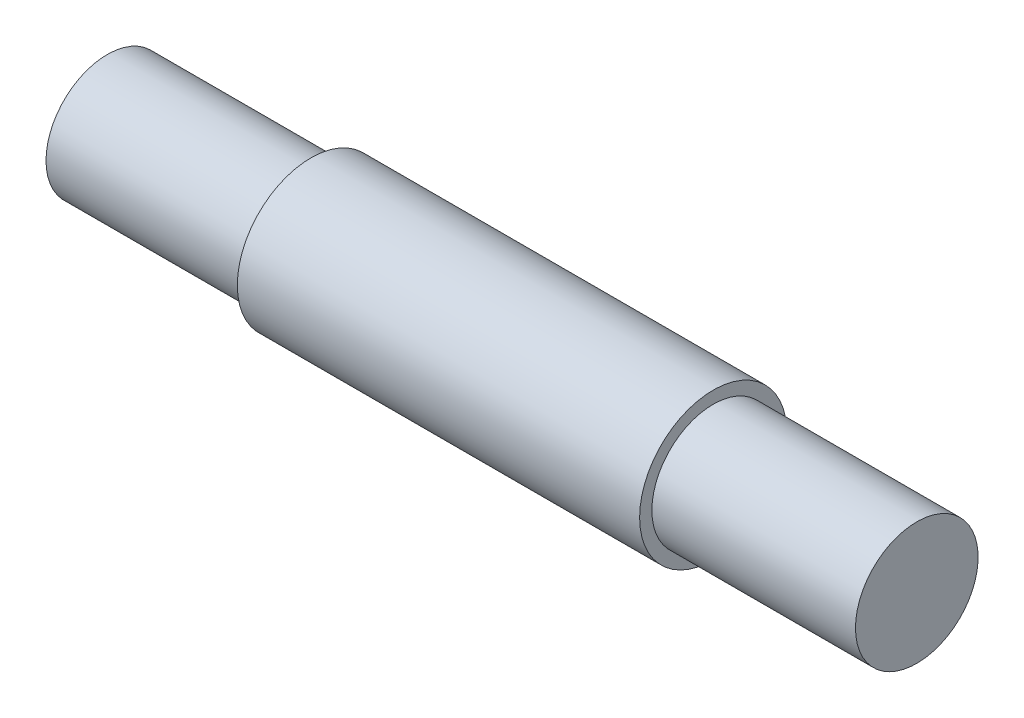
ISO-10303-21;
HEADER;
FILE_DESCRIPTION(('STEP AP214'),'2;1');
FILE_NAME('part.step','',(''),(''),'','','');
FILE_SCHEMA(('AUTOMOTIVE_DESIGN { 1 0 10303 214 1 1 1 1 }'));
ENDSEC;
DATA;
#1=APPLICATION_CONTEXT('core data for automotive mechanical design processes');
#2=APPLICATION_PROTOCOL_DEFINITION('international standard','automotive_design',2000,#1);
#3=PRODUCT_CONTEXT('',#1,'mechanical');
#4=PRODUCT('Part','Part','',(#3));
#5=PRODUCT_RELATED_PRODUCT_CATEGORY('part','',(#4));
#6=PRODUCT_DEFINITION_FORMATION('','',#4);
#7=PRODUCT_DEFINITION_CONTEXT('part definition',#1,'design');
#8=PRODUCT_DEFINITION('design','',#6,#7);
#9=PRODUCT_DEFINITION_SHAPE('','',#8);
#10=(LENGTH_UNIT() NAMED_UNIT(*) SI_UNIT(.MILLI.,.METRE.));
#11=(NAMED_UNIT(*) PLANE_ANGLE_UNIT() SI_UNIT($,.RADIAN.));
#12=(NAMED_UNIT(*) SI_UNIT($,.STERADIAN.) SOLID_ANGLE_UNIT());
#13=UNCERTAINTY_MEASURE_WITH_UNIT(LENGTH_MEASURE(1.E-05),#10,'distance_accuracy_value','');
#14=(GEOMETRIC_REPRESENTATION_CONTEXT(3) GLOBAL_UNCERTAINTY_ASSIGNED_CONTEXT((#13)) GLOBAL_UNIT_ASSIGNED_CONTEXT((#10,
#11,#12)) REPRESENTATION_CONTEXT('',''));
#15=CARTESIAN_POINT('',(0.,0.,0.));
#16=DIRECTION('',(0.,0.,1.));
#17=DIRECTION('',(1.,0.,0.));
#18=AXIS2_PLACEMENT_3D('',#15,#16,#17);
#19=CARTESIAN_POINT('',(-145.774647887324,0.,0.));
#20=DIRECTION('',(1.,0.,0.));
#21=DIRECTION('',(0.,0.,-1.));
#22=AXIS2_PLACEMENT_3D('',#19,#20,#21);
#23=PLANE('',#22);
#24=CARTESIAN_POINT('',(-145.774647887324,0.,0.));
#25=DIRECTION('',(-1.,0.,0.));
#26=DIRECTION('',(0.,0.,1.));
#27=AXIS2_PLACEMENT_3D('',#24,#25,#26);
#28=CIRCLE('',#27,25.);
#29=CARTESIAN_POINT('',(-145.774647887324,0.,25.0000000000001));
#30=VERTEX_POINT('',#29);
#31=EDGE_CURVE('E10',#30,#30,#28,.T.);
#32=ORIENTED_EDGE('',*,*,#31,.T.);
#33=EDGE_LOOP('',(#32));
#34=FACE_BOUND('',#33,.T.);
#35=ADVANCED_FACE('F42',(#34),#23,.F.);
#36=CARTESIAN_POINT('',(-145.774647887324,0.,0.));
#37=DIRECTION('',(-1.,0.,0.));
#38=DIRECTION('',(0.,0.,1.));
#39=AXIS2_PLACEMENT_3D('',#36,#37,#38);
#40=CYLINDRICAL_SURFACE('',#39,25.);
#41=ORIENTED_EDGE('',*,*,#31,.F.);
#42=EDGE_LOOP('',(#41));
#43=FACE_BOUND('',#42,.T.);
#44=CARTESIAN_POINT('',(-62.774647887324,0.,0.));
#45=DIRECTION('',(-1.,0.,0.));
#46=DIRECTION('',(0.,0.,1.));
#47=AXIS2_PLACEMENT_3D('',#44,#45,#46);
#48=CIRCLE('',#47,25.);
#49=CARTESIAN_POINT('',(-62.774647887324,0.,25.0000000000001));
#50=VERTEX_POINT('',#49);
#51=EDGE_CURVE('E49',#50,#50,#48,.T.);
#52=ORIENTED_EDGE('',*,*,#51,.T.);
#53=EDGE_LOOP('',(#52));
#54=FACE_BOUND('',#53,.T.);
#55=ADVANCED_FACE('F89',(#43,#54),#40,.T.);
#56=CARTESIAN_POINT('',(-62.774647887324,-1.66533453693773E-13,-25.0000000000006));
#57=DIRECTION('',(1.,0.,0.));
#58=DIRECTION('',(0.,0.,-1.));
#59=AXIS2_PLACEMENT_3D('',#56,#57,#58);
#60=PLANE('',#59);
#61=ORIENTED_EDGE('',*,*,#51,.F.);
#62=EDGE_LOOP('',(#61));
#63=FACE_BOUND('',#62,.T.);
#64=CARTESIAN_POINT('',(-62.774647887324,0.,0.));
#65=DIRECTION('',(-1.,0.,0.));
#66=DIRECTION('',(0.,0.,1.));
#67=AXIS2_PLACEMENT_3D('',#64,#65,#66);
#68=CIRCLE('',#67,30.);
#69=CARTESIAN_POINT('',(-62.774647887324,0.,30.0000000000001));
#70=VERTEX_POINT('',#69);
#71=EDGE_CURVE('E55',#70,#70,#68,.T.);
#72=ORIENTED_EDGE('',*,*,#71,.T.);
#73=EDGE_LOOP('',(#72));
#74=FACE_BOUND('',#73,.T.);
#75=ADVANCED_FACE('F93',(#63,#74),#60,.F.);
#76=CARTESIAN_POINT('',(-145.774647887324,0.,0.));
#77=DIRECTION('',(-1.,0.,0.));
#78=DIRECTION('',(0.,0.,1.));
#79=AXIS2_PLACEMENT_3D('',#76,#77,#78);
#80=CYLINDRICAL_SURFACE('',#79,30.);
#81=ORIENTED_EDGE('',*,*,#71,.F.);
#82=EDGE_LOOP('',(#81));
#83=FACE_BOUND('',#82,.T.);
#84=CARTESIAN_POINT('',(101.225352112676,0.,0.));
#85=DIRECTION('',(-1.,0.,0.));
#86=DIRECTION('',(0.,0.,1.));
#87=AXIS2_PLACEMENT_3D('',#84,#85,#86);
#88=CIRCLE('',#87,30.);
#89=CARTESIAN_POINT('',(101.225352112676,0.,30.0000000000001));
#90=VERTEX_POINT('',#89);
#91=EDGE_CURVE('E61',#90,#90,#88,.T.);
#92=ORIENTED_EDGE('',*,*,#91,.T.);
#93=EDGE_LOOP('',(#92));
#94=FACE_BOUND('',#93,.T.);
#95=ADVANCED_FACE('F98',(#83,#94),#80,.T.);
#96=CARTESIAN_POINT('',(101.225352112676,-2.22044604925031E-13,-30.0000000000005));
#97=DIRECTION('',(-1.,0.,0.));
#98=DIRECTION('',(0.,0.,1.));
#99=AXIS2_PLACEMENT_3D('',#96,#97,#98);
#100=PLANE('',#99);
#101=ORIENTED_EDGE('',*,*,#91,.F.);
#102=EDGE_LOOP('',(#101));
#103=FACE_BOUND('',#102,.T.);
#104=CARTESIAN_POINT('',(101.225352112676,0.,0.));
#105=DIRECTION('',(-1.,0.,0.));
#106=DIRECTION('',(0.,0.,1.));
#107=AXIS2_PLACEMENT_3D('',#104,#105,#106);
#108=CIRCLE('',#107,25.);
#109=CARTESIAN_POINT('',(101.225352112676,0.,25.0000000000001));
#110=VERTEX_POINT('',#109);
#111=EDGE_CURVE('E67',#110,#110,#108,.T.);
#112=ORIENTED_EDGE('',*,*,#111,.T.);
#113=EDGE_LOOP('',(#112));
#114=FACE_BOUND('',#113,.T.);
#115=ADVANCED_FACE('F85',(#103,#114),#100,.F.);
#116=CARTESIAN_POINT('',(-145.774647887324,0.,0.));
#117=DIRECTION('',(-1.,0.,0.));
#118=DIRECTION('',(0.,0.,1.));
#119=AXIS2_PLACEMENT_3D('',#116,#117,#118);
#120=CYLINDRICAL_SURFACE('',#119,25.);
#121=ORIENTED_EDGE('',*,*,#111,.F.);
#122=EDGE_LOOP('',(#121));
#123=FACE_BOUND('',#122,.T.);
#124=CARTESIAN_POINT('',(184.225352112676,0.,0.));
#125=DIRECTION('',(-1.,0.,0.));
#126=DIRECTION('',(0.,0.,1.));
#127=AXIS2_PLACEMENT_3D('',#124,#125,#126);
#128=CIRCLE('',#127,25.);
#129=CARTESIAN_POINT('',(184.225352112676,0.,25.0000000000001));
#130=VERTEX_POINT('',#129);
#131=EDGE_CURVE('E71',#130,#130,#128,.T.);
#132=ORIENTED_EDGE('',*,*,#131,.T.);
#133=EDGE_LOOP('',(#132));
#134=FACE_BOUND('',#133,.T.);
#135=ADVANCED_FACE('F77',(#123,#134),#120,.T.);
#136=CARTESIAN_POINT('',(184.225352112676,-2.22044604925031E-13,-25.0000000000002));
#137=DIRECTION('',(-1.,0.,0.));
#138=DIRECTION('',(0.,0.,1.));
#139=AXIS2_PLACEMENT_3D('',#136,#137,#138);
#140=PLANE('',#139);
#141=ORIENTED_EDGE('',*,*,#131,.F.);
#142=EDGE_LOOP('',(#141));
#143=FACE_BOUND('',#142,.T.);
#144=ADVANCED_FACE('F79',(#143),#140,.F.);
#145=CLOSED_SHELL('',(#35,#55,#75,#95,#115,#135,#144));
#146=MANIFOLD_SOLID_BREP('B2',#145);
#147=ADVANCED_BREP_SHAPE_REPRESENTATION('',(#18,#146),#14);
#148=SHAPE_DEFINITION_REPRESENTATION(#9,#147);
ENDSEC;
END-ISO-10303-21;
